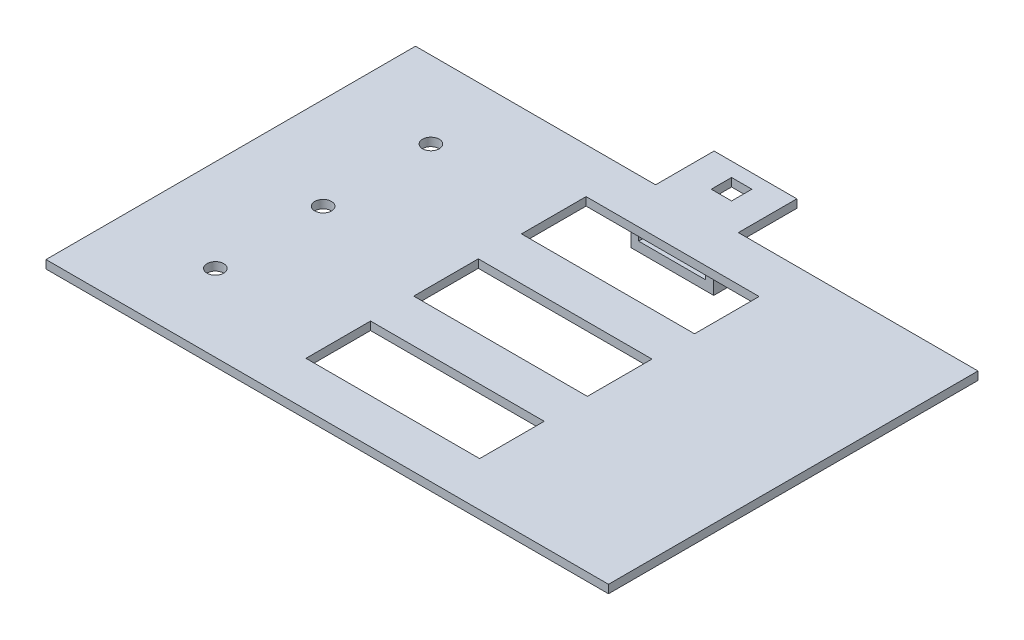
ISO-10303-21;
HEADER;
FILE_DESCRIPTION(('STEP AP214'),'2;1');
FILE_NAME('part.step','',(''),(''),'','','');
FILE_SCHEMA(('AUTOMOTIVE_DESIGN { 1 0 10303 214 1 1 1 1 }'));
ENDSEC;
DATA;
#1=APPLICATION_CONTEXT('core data for automotive mechanical design processes');
#2=APPLICATION_PROTOCOL_DEFINITION('international standard','automotive_design',2000,#1);
#3=PRODUCT_CONTEXT('',#1,'mechanical');
#4=PRODUCT('Part','Part','',(#3));
#5=PRODUCT_RELATED_PRODUCT_CATEGORY('part','',(#4));
#6=PRODUCT_DEFINITION_FORMATION('','',#4);
#7=PRODUCT_DEFINITION_CONTEXT('part definition',#1,'design');
#8=PRODUCT_DEFINITION('design','',#6,#7);
#9=PRODUCT_DEFINITION_SHAPE('','',#8);
#10=(LENGTH_UNIT() NAMED_UNIT(*) SI_UNIT(.MILLI.,.METRE.));
#11=(NAMED_UNIT(*) PLANE_ANGLE_UNIT() SI_UNIT($,.RADIAN.));
#12=(NAMED_UNIT(*) SI_UNIT($,.STERADIAN.) SOLID_ANGLE_UNIT());
#13=UNCERTAINTY_MEASURE_WITH_UNIT(LENGTH_MEASURE(1.E-05),#10,'distance_accuracy_value','');
#14=(GEOMETRIC_REPRESENTATION_CONTEXT(3) GLOBAL_UNCERTAINTY_ASSIGNED_CONTEXT((#13)) GLOBAL_UNIT_ASSIGNED_CONTEXT((#10,
#11,#12)) REPRESENTATION_CONTEXT('',''));
#15=CARTESIAN_POINT('',(0.,0.,0.));
#16=DIRECTION('',(0.,0.,1.));
#17=DIRECTION('',(1.,0.,0.));
#18=AXIS2_PLACEMENT_3D('',#15,#16,#17);
#19=CARTESIAN_POINT('',(0.,3.4036,-152.4));
#20=DIRECTION('',(0.,0.,1.));
#21=DIRECTION('',(1.,0.,0.));
#22=AXIS2_PLACEMENT_3D('',#19,#20,#21);
#23=PLANE('',#22);
#24=DIRECTION('',(0.,-1.,0.));
#25=VECTOR('',#24,1.);
#26=CARTESIAN_POINT('',(133.1595,0.,-152.4));
#27=LINE('',#26,#25);
#28=CARTESIAN_POINT('',(133.1595,3.4036,-152.4));
#29=VERTEX_POINT('',#28);
#30=CARTESIAN_POINT('',(133.1595,0.,-152.4));
#31=VERTEX_POINT('',#30);
#32=EDGE_CURVE('E287',#29,#31,#27,.T.);
#33=ORIENTED_EDGE('',*,*,#32,.F.);
#34=DIRECTION('',(-1.,0.,0.));
#35=VECTOR('',#34,1.);
#36=CARTESIAN_POINT('',(0.,3.4036,-152.4));
#37=LINE('',#36,#35);
#38=CARTESIAN_POINT('',(232.0036,3.4036,-152.4));
#39=VERTEX_POINT('',#38);
#40=EDGE_CURVE('E584',#39,#29,#37,.T.);
#41=ORIENTED_EDGE('',*,*,#40,.F.);
#42=DIRECTION('',(0.,-1.,0.));
#43=VECTOR('',#42,1.);
#44=CARTESIAN_POINT('',(232.0036,3.4036,-152.4));
#45=LINE('',#44,#43);
#46=CARTESIAN_POINT('',(232.0036,0.,-152.4));
#47=VERTEX_POINT('',#46);
#48=EDGE_CURVE('E605',#39,#47,#45,.T.);
#49=ORIENTED_EDGE('',*,*,#48,.T.);
#50=DIRECTION('',(-1.,0.,0.));
#51=VECTOR('',#50,1.);
#52=CARTESIAN_POINT('',(0.,0.,-152.4));
#53=LINE('',#52,#51);
#54=EDGE_CURVE('E577',#47,#31,#53,.T.);
#55=ORIENTED_EDGE('',*,*,#54,.T.);
#56=EDGE_LOOP('',(#33,#41,#49,#55));
#57=FACE_BOUND('',#56,.T.);
#58=ADVANCED_FACE('F46',(#57),#23,.F.);
#59=DIRECTION('',(0.,1.,0.));
#60=VECTOR('',#59,1.);
#61=CARTESIAN_POINT('',(99.0219,0.,-152.4));
#62=LINE('',#61,#60);
#63=CARTESIAN_POINT('',(99.0219,0.,-152.4));
#64=VERTEX_POINT('',#63);
#65=CARTESIAN_POINT('',(99.0219,3.4036,-152.4));
#66=VERTEX_POINT('',#65);
#67=EDGE_CURVE('E297',#64,#66,#62,.T.);
#68=ORIENTED_EDGE('',*,*,#67,.F.);
#69=CARTESIAN_POINT('',(0.,0.,-152.4));
#70=VERTEX_POINT('',#69);
#71=EDGE_CURVE('E598',#64,#70,#53,.T.);
#72=ORIENTED_EDGE('',*,*,#71,.T.);
#73=DIRECTION('',(0.,-1.,0.));
#74=VECTOR('',#73,1.);
#75=CARTESIAN_POINT('',(0.,3.4036,-152.4));
#76=LINE('',#75,#74);
#77=CARTESIAN_POINT('',(0.,3.4036,-152.4));
#78=VERTEX_POINT('',#77);
#79=EDGE_CURVE('E588',#78,#70,#76,.T.);
#80=ORIENTED_EDGE('',*,*,#79,.F.);
#81=EDGE_CURVE('E583',#66,#78,#37,.T.);
#82=ORIENTED_EDGE('',*,*,#81,.F.);
#83=EDGE_LOOP('',(#68,#72,#80,#82));
#84=FACE_BOUND('',#83,.T.);
#85=ADVANCED_FACE('F641',(#84),#23,.F.);
#86=CARTESIAN_POINT('',(0.,3.4036,0.));
#87=DIRECTION('',(1.,0.,0.));
#88=DIRECTION('',(0.,0.,-1.));
#89=AXIS2_PLACEMENT_3D('',#86,#87,#88);
#90=PLANE('',#89);
#91=DIRECTION('',(0.,0.,1.));
#92=VECTOR('',#91,1.);
#93=CARTESIAN_POINT('',(0.,0.,0.));
#94=LINE('',#93,#92);
#95=CARTESIAN_POINT('',(0.,0.,0.));
#96=VERTEX_POINT('',#95);
#97=EDGE_CURVE('E562',#70,#96,#94,.T.);
#98=ORIENTED_EDGE('',*,*,#97,.T.);
#99=DIRECTION('',(0.,-1.,0.));
#100=VECTOR('',#99,1.);
#101=CARTESIAN_POINT('',(0.,3.4036,0.));
#102=LINE('',#101,#100);
#103=CARTESIAN_POINT('',(0.,3.4036,0.));
#104=VERTEX_POINT('',#103);
#105=EDGE_CURVE('E389',#104,#96,#102,.T.);
#106=ORIENTED_EDGE('',*,*,#105,.F.);
#107=DIRECTION('',(0.,0.,1.));
#108=VECTOR('',#107,1.);
#109=CARTESIAN_POINT('',(0.,3.4036,0.));
#110=LINE('',#109,#108);
#111=EDGE_CURVE('E572',#78,#104,#110,.T.);
#112=ORIENTED_EDGE('',*,*,#111,.F.);
#113=ORIENTED_EDGE('',*,*,#79,.T.);
#114=EDGE_LOOP('',(#98,#106,#112,#113));
#115=FACE_BOUND('',#114,.T.);
#116=ADVANCED_FACE('F48',(#115),#90,.F.);
#117=CARTESIAN_POINT('',(0.,3.4036,0.));
#118=DIRECTION('',(0.,0.,-1.));
#119=DIRECTION('',(-1.,0.,0.));
#120=AXIS2_PLACEMENT_3D('',#117,#118,#119);
#121=PLANE('',#120);
#122=DIRECTION('',(1.,0.,0.));
#123=VECTOR('',#122,1.);
#124=CARTESIAN_POINT('',(0.,0.,0.));
#125=LINE('',#124,#123);
#126=CARTESIAN_POINT('',(232.0036,0.,0.));
#127=VERTEX_POINT('',#126);
#128=EDGE_CURVE('E592',#96,#127,#125,.T.);
#129=ORIENTED_EDGE('',*,*,#128,.T.);
#130=DIRECTION('',(0.,-1.,0.));
#131=VECTOR('',#130,1.);
#132=CARTESIAN_POINT('',(232.0036,3.4036,0.));
#133=LINE('',#132,#131);
#134=CARTESIAN_POINT('',(232.0036,3.4036,0.));
#135=VERTEX_POINT('',#134);
#136=EDGE_CURVE('E609',#135,#127,#133,.T.);
#137=ORIENTED_EDGE('',*,*,#136,.F.);
#138=DIRECTION('',(1.,0.,0.));
#139=VECTOR('',#138,1.);
#140=CARTESIAN_POINT('',(0.,3.4036,0.));
#141=LINE('',#140,#139);
#142=EDGE_CURVE('E576',#104,#135,#141,.T.);
#143=ORIENTED_EDGE('',*,*,#142,.F.);
#144=ORIENTED_EDGE('',*,*,#105,.T.);
#145=EDGE_LOOP('',(#129,#137,#143,#144));
#146=FACE_BOUND('',#145,.T.);
#147=ADVANCED_FACE('F656',(#146),#121,.F.);
#148=CARTESIAN_POINT('',(232.0036,3.4036,0.));
#149=DIRECTION('',(-1.,0.,0.));
#150=DIRECTION('',(0.,0.,1.));
#151=AXIS2_PLACEMENT_3D('',#148,#149,#150);
#152=PLANE('',#151);
#153=DIRECTION('',(0.,0.,-1.));
#154=VECTOR('',#153,1.);
#155=CARTESIAN_POINT('',(232.0036,0.,0.));
#156=LINE('',#155,#154);
#157=EDGE_CURVE('E595',#127,#47,#156,.T.);
#158=ORIENTED_EDGE('',*,*,#157,.T.);
#159=ORIENTED_EDGE('',*,*,#48,.F.);
#160=DIRECTION('',(0.,0.,-1.));
#161=VECTOR('',#160,1.);
#162=CARTESIAN_POINT('',(232.0036,3.4036,0.));
#163=LINE('',#162,#161);
#164=EDGE_CURVE('E580',#135,#39,#163,.T.);
#165=ORIENTED_EDGE('',*,*,#164,.F.);
#166=ORIENTED_EDGE('',*,*,#136,.T.);
#167=EDGE_LOOP('',(#158,#159,#165,#166));
#168=FACE_BOUND('',#167,.T.);
#169=ADVANCED_FACE('F654',(#168),#152,.F.);
#170=CARTESIAN_POINT('',(0.,3.4036,0.));
#171=DIRECTION('',(0.,-1.,0.));
#172=DIRECTION('',(0.,0.,-1.));
#173=AXIS2_PLACEMENT_3D('',#170,#171,#172);
#174=PLANE('',#173);
#175=DIRECTION('',(1.,0.,0.));
#176=VECTOR('',#175,1.);
#177=CARTESIAN_POINT('',(112.0775,3.4036,-162.306));
#178=LINE('',#177,#176);
#179=CARTESIAN_POINT('',(112.0775,3.4036,-162.306));
#180=VERTEX_POINT('',#179);
#181=CARTESIAN_POINT('',(120.4595,3.4036,-162.306));
#182=VERTEX_POINT('',#181);
#183=EDGE_CURVE('E269',#180,#182,#178,.T.);
#184=ORIENTED_EDGE('',*,*,#183,.F.);
#185=DIRECTION('',(0.,0.,1.));
#186=VECTOR('',#185,1.);
#187=CARTESIAN_POINT('',(112.0775,3.4036,-170.688));
#188=LINE('',#187,#186);
#189=CARTESIAN_POINT('',(112.0775,3.4036,-170.688));
#190=VERTEX_POINT('',#189);
#191=EDGE_CURVE('E62',#190,#180,#188,.T.);
#192=ORIENTED_EDGE('',*,*,#191,.F.);
#193=DIRECTION('',(-1.,0.,0.));
#194=VECTOR('',#193,1.);
#195=CARTESIAN_POINT('',(112.0775,3.4036,-170.688));
#196=LINE('',#195,#194);
#197=CARTESIAN_POINT('',(120.4595,3.4036,-170.688));
#198=VERTEX_POINT('',#197);
#199=EDGE_CURVE('E277',#198,#190,#196,.T.);
#200=ORIENTED_EDGE('',*,*,#199,.F.);
#201=DIRECTION('',(0.,0.,-1.));
#202=VECTOR('',#201,1.);
#203=CARTESIAN_POINT('',(120.4595,3.4036,-170.688));
#204=LINE('',#203,#202);
#205=EDGE_CURVE('E259',#182,#198,#204,.T.);
#206=ORIENTED_EDGE('',*,*,#205,.F.);
#207=EDGE_LOOP('',(#184,#192,#200,#206));
#208=FACE_BOUND('',#207,.T.);
#209=DIRECTION('',(1.,0.,0.));
#210=VECTOR('',#209,1.);
#211=CARTESIAN_POINT('',(88.9,3.4036,-62.7634));
#212=LINE('',#211,#210);
#213=CARTESIAN_POINT('',(88.9,3.4036,-62.7634));
#214=VERTEX_POINT('',#213);
#215=CARTESIAN_POINT('',(160.528,3.4036,-62.7634));
#216=VERTEX_POINT('',#215);
#217=EDGE_CURVE('E448',#214,#216,#212,.T.);
#218=ORIENTED_EDGE('',*,*,#217,.F.);
#219=DIRECTION('',(0.,0.,1.));
#220=VECTOR('',#219,1.);
#221=CARTESIAN_POINT('',(88.9,3.4036,-89.408));
#222=LINE('',#221,#220);
#223=CARTESIAN_POINT('',(88.9,3.4036,-89.408));
#224=VERTEX_POINT('',#223);
#225=EDGE_CURVE('E452',#224,#214,#222,.T.);
#226=ORIENTED_EDGE('',*,*,#225,.F.);
#227=DIRECTION('',(-1.,0.,0.));
#228=VECTOR('',#227,1.);
#229=CARTESIAN_POINT('',(88.9,3.4036,-89.408));
#230=LINE('',#229,#228);
#231=CARTESIAN_POINT('',(160.528,3.4036,-89.408));
#232=VERTEX_POINT('',#231);
#233=EDGE_CURVE('E439',#232,#224,#230,.T.);
#234=ORIENTED_EDGE('',*,*,#233,.F.);
#235=DIRECTION('',(0.,0.,-1.));
#236=VECTOR('',#235,1.);
#237=CARTESIAN_POINT('',(160.528,3.4036,-89.408));
#238=LINE('',#237,#236);
#239=EDGE_CURVE('E443',#216,#232,#238,.T.);
#240=ORIENTED_EDGE('',*,*,#239,.F.);
#241=EDGE_LOOP('',(#218,#226,#234,#240));
#242=FACE_BOUND('',#241,.T.);
#243=DIRECTION('',(1.,0.,0.));
#244=VECTOR('',#243,1.);
#245=CARTESIAN_POINT('',(88.9,3.4036,-18.3134));
#246=LINE('',#245,#244);
#247=CARTESIAN_POINT('',(88.9,3.4036,-18.3134));
#248=VERTEX_POINT('',#247);
#249=CARTESIAN_POINT('',(160.528,3.4036,-18.3134));
#250=VERTEX_POINT('',#249);
#251=EDGE_CURVE('E494',#248,#250,#246,.T.);
#252=ORIENTED_EDGE('',*,*,#251,.F.);
#253=DIRECTION('',(0.,0.,1.));
#254=VECTOR('',#253,1.);
#255=CARTESIAN_POINT('',(88.9,3.4036,-44.958));
#256=LINE('',#255,#254);
#257=CARTESIAN_POINT('',(88.9,3.4036,-44.958));
#258=VERTEX_POINT('',#257);
#259=EDGE_CURVE('E438',#258,#248,#256,.T.);
#260=ORIENTED_EDGE('',*,*,#259,.F.);
#261=DIRECTION('',(-1.,0.,0.));
#262=VECTOR('',#261,1.);
#263=CARTESIAN_POINT('',(88.9,3.4036,-44.958));
#264=LINE('',#263,#262);
#265=CARTESIAN_POINT('',(160.528,3.4036,-44.958));
#266=VERTEX_POINT('',#265);
#267=EDGE_CURVE('E485',#266,#258,#264,.T.);
#268=ORIENTED_EDGE('',*,*,#267,.F.);
#269=DIRECTION('',(0.,0.,-1.));
#270=VECTOR('',#269,1.);
#271=CARTESIAN_POINT('',(160.528,3.4036,-44.958));
#272=LINE('',#271,#270);
#273=EDGE_CURVE('E489',#250,#266,#272,.T.);
#274=ORIENTED_EDGE('',*,*,#273,.F.);
#275=EDGE_LOOP('',(#252,#260,#268,#274));
#276=FACE_BOUND('',#275,.T.);
#277=CARTESIAN_POINT('',(38.1,3.4036,-120.65));
#278=DIRECTION('',(0.,1.,0.));
#279=DIRECTION('',(0.,0.,1.));
#280=AXIS2_PLACEMENT_3D('',#277,#278,#279);
#281=CIRCLE('',#280,3.4417);
#282=CARTESIAN_POINT('',(38.1,3.4036,-117.2083));
#283=VERTEX_POINT('',#282);
#284=EDGE_CURVE('E484',#283,#283,#281,.T.);
#285=ORIENTED_EDGE('',*,*,#284,.F.);
#286=EDGE_LOOP('',(#285));
#287=FACE_BOUND('',#286,.T.);
#288=CARTESIAN_POINT('',(38.1,3.4036,-76.2));
#289=DIRECTION('',(0.,1.,0.));
#290=DIRECTION('',(0.,0.,1.));
#291=AXIS2_PLACEMENT_3D('',#288,#289,#290);
#292=CIRCLE('',#291,3.4417);
#293=CARTESIAN_POINT('',(38.1,3.4036,-72.7583));
#294=VERTEX_POINT('',#293);
#295=EDGE_CURVE('E521',#294,#294,#292,.T.);
#296=ORIENTED_EDGE('',*,*,#295,.F.);
#297=EDGE_LOOP('',(#296));
#298=FACE_BOUND('',#297,.T.);
#299=CARTESIAN_POINT('',(38.1,3.4036,-31.75));
#300=DIRECTION('',(0.,1.,0.));
#301=DIRECTION('',(0.,0.,1.));
#302=AXIS2_PLACEMENT_3D('',#299,#300,#301);
#303=CIRCLE('',#302,3.4417);
#304=CARTESIAN_POINT('',(38.1,3.4036,-28.3083));
#305=VERTEX_POINT('',#304);
#306=EDGE_CURVE('E416',#305,#305,#303,.T.);
#307=ORIENTED_EDGE('',*,*,#306,.F.);
#308=EDGE_LOOP('',(#307));
#309=FACE_BOUND('',#308,.T.);
#310=DIRECTION('',(1.,0.,0.));
#311=VECTOR('',#310,1.);
#312=CARTESIAN_POINT('',(88.9,3.4036,-107.2134));
#313=LINE('',#312,#311);
#314=CARTESIAN_POINT('',(88.9,3.4036,-107.2134));
#315=VERTEX_POINT('',#314);
#316=CARTESIAN_POINT('',(160.274,3.4036,-107.2134));
#317=VERTEX_POINT('',#316);
#318=EDGE_CURVE('E548',#315,#317,#313,.T.);
#319=ORIENTED_EDGE('',*,*,#318,.F.);
#320=DIRECTION('',(0.,0.,1.));
#321=VECTOR('',#320,1.);
#322=CARTESIAN_POINT('',(88.9,3.4036,-133.858));
#323=LINE('',#322,#321);
#324=CARTESIAN_POINT('',(88.9,3.4036,-133.858));
#325=VERTEX_POINT('',#324);
#326=EDGE_CURVE('E455',#325,#315,#323,.T.);
#327=ORIENTED_EDGE('',*,*,#326,.F.);
#328=DIRECTION('',(-1.,0.,0.));
#329=VECTOR('',#328,1.);
#330=CARTESIAN_POINT('',(88.9,3.4036,-133.858));
#331=LINE('',#330,#329);
#332=CARTESIAN_POINT('',(160.274,3.4036,-133.858));
#333=VERTEX_POINT('',#332);
#334=EDGE_CURVE('E533',#333,#325,#331,.T.);
#335=ORIENTED_EDGE('',*,*,#334,.F.);
#336=DIRECTION('',(0.,0.,-1.));
#337=VECTOR('',#336,1.);
#338=CARTESIAN_POINT('',(160.274,3.4036,-133.858));
#339=LINE('',#338,#337);
#340=EDGE_CURVE('E552',#317,#333,#339,.T.);
#341=ORIENTED_EDGE('',*,*,#340,.F.);
#342=EDGE_LOOP('',(#319,#327,#335,#341));
#343=FACE_BOUND('',#342,.T.);
#344=ORIENTED_EDGE('',*,*,#111,.T.);
#345=ORIENTED_EDGE('',*,*,#142,.T.);
#346=ORIENTED_EDGE('',*,*,#164,.T.);
#347=ORIENTED_EDGE('',*,*,#40,.T.);
#348=DIRECTION('',(0.,0.,1.));
#349=VECTOR('',#348,1.);
#350=CARTESIAN_POINT('',(133.1595,3.4036,-176.53));
#351=LINE('',#350,#349);
#352=CARTESIAN_POINT('',(133.1595,3.4036,-176.53));
#353=VERTEX_POINT('',#352);
#354=EDGE_CURVE('E306',#353,#29,#351,.T.);
#355=ORIENTED_EDGE('',*,*,#354,.F.);
#356=DIRECTION('',(1.,0.,0.));
#357=VECTOR('',#356,1.);
#358=CARTESIAN_POINT('',(133.1595,3.4036,-176.53));
#359=LINE('',#358,#357);
#360=CARTESIAN_POINT('',(99.0219,3.4036,-176.53));
#361=VERTEX_POINT('',#360);
#362=EDGE_CURVE('E303',#361,#353,#359,.T.);
#363=ORIENTED_EDGE('',*,*,#362,.F.);
#364=DIRECTION('',(0.,0.,1.));
#365=VECTOR('',#364,1.);
#366=CARTESIAN_POINT('',(99.0219,3.4036,-176.53));
#367=LINE('',#366,#365);
#368=EDGE_CURVE('E313',#361,#66,#367,.T.);
#369=ORIENTED_EDGE('',*,*,#368,.T.);
#370=ORIENTED_EDGE('',*,*,#81,.T.);
#371=EDGE_LOOP('',(#344,#345,#346,#347,#355,#363,#369,#370));
#372=FACE_BOUND('',#371,.T.);
#373=ADVANCED_FACE('F274',(#208,#242,#276,#287,#298,#309,#343,#372),#174,.F.);
#374=CARTESIAN_POINT('',(0.,0.,0.));
#375=DIRECTION('',(0.,-1.,0.));
#376=DIRECTION('',(0.,0.,-1.));
#377=AXIS2_PLACEMENT_3D('',#374,#375,#376);
#378=PLANE('',#377);
#379=DIRECTION('',(0.,0.,1.));
#380=VECTOR('',#379,1.);
#381=CARTESIAN_POINT('',(133.1595,0.,-142.24));
#382=LINE('',#381,#380);
#383=CARTESIAN_POINT('',(133.1595,0.,-142.24));
#384=VERTEX_POINT('',#383);
#385=EDGE_CURVE('E384',#31,#384,#382,.T.);
#386=ORIENTED_EDGE('',*,*,#385,.F.);
#387=ORIENTED_EDGE('',*,*,#54,.F.);
#388=ORIENTED_EDGE('',*,*,#157,.F.);
#389=ORIENTED_EDGE('',*,*,#128,.F.);
#390=ORIENTED_EDGE('',*,*,#97,.F.);
#391=ORIENTED_EDGE('',*,*,#71,.F.);
#392=DIRECTION('',(0.,0.,-1.));
#393=VECTOR('',#392,1.);
#394=CARTESIAN_POINT('',(99.0219,0.,-142.24));
#395=LINE('',#394,#393);
#396=CARTESIAN_POINT('',(99.0219,0.,-142.24));
#397=VERTEX_POINT('',#396);
#398=EDGE_CURVE('E393',#397,#64,#395,.T.);
#399=ORIENTED_EDGE('',*,*,#398,.F.);
#400=DIRECTION('',(-1.,0.,0.));
#401=VECTOR('',#400,1.);
#402=CARTESIAN_POINT('',(133.1595,0.,-142.24));
#403=LINE('',#402,#401);
#404=EDGE_CURVE('E368',#384,#397,#403,.T.);
#405=ORIENTED_EDGE('',*,*,#404,.F.);
#406=EDGE_LOOP('',(#386,#387,#388,#389,#390,#391,#399,#405));
#407=FACE_BOUND('',#406,.T.);
#408=DIRECTION('',(0.,0.,1.));
#409=VECTOR('',#408,1.);
#410=CARTESIAN_POINT('',(88.9,0.,-89.408));
#411=LINE('',#410,#409);
#412=CARTESIAN_POINT('',(88.9,0.,-89.408));
#413=VERTEX_POINT('',#412);
#414=CARTESIAN_POINT('',(88.9,0.,-62.7634));
#415=VERTEX_POINT('',#414);
#416=EDGE_CURVE('E444',#413,#415,#411,.T.);
#417=ORIENTED_EDGE('',*,*,#416,.T.);
#418=DIRECTION('',(1.,0.,0.));
#419=VECTOR('',#418,1.);
#420=CARTESIAN_POINT('',(88.9,0.,-62.7634));
#421=LINE('',#420,#419);
#422=CARTESIAN_POINT('',(160.528,0.,-62.7634));
#423=VERTEX_POINT('',#422);
#424=EDGE_CURVE('E463',#415,#423,#421,.T.);
#425=ORIENTED_EDGE('',*,*,#424,.T.);
#426=DIRECTION('',(0.,0.,-1.));
#427=VECTOR('',#426,1.);
#428=CARTESIAN_POINT('',(160.528,0.,-89.408));
#429=LINE('',#428,#427);
#430=CARTESIAN_POINT('',(160.528,0.,-89.408));
#431=VERTEX_POINT('',#430);
#432=EDGE_CURVE('E459',#423,#431,#429,.T.);
#433=ORIENTED_EDGE('',*,*,#432,.T.);
#434=DIRECTION('',(-1.,0.,0.));
#435=VECTOR('',#434,1.);
#436=CARTESIAN_POINT('',(88.9,0.,-89.408));
#437=LINE('',#436,#435);
#438=EDGE_CURVE('E428',#431,#413,#437,.T.);
#439=ORIENTED_EDGE('',*,*,#438,.T.);
#440=EDGE_LOOP('',(#417,#425,#433,#439));
#441=FACE_BOUND('',#440,.T.);
#442=DIRECTION('',(0.,0.,1.));
#443=VECTOR('',#442,1.);
#444=CARTESIAN_POINT('',(88.9,0.,-44.958));
#445=LINE('',#444,#443);
#446=CARTESIAN_POINT('',(88.9,0.,-44.958));
#447=VERTEX_POINT('',#446);
#448=CARTESIAN_POINT('',(88.9,0.,-18.3134));
#449=VERTEX_POINT('',#448);
#450=EDGE_CURVE('E490',#447,#449,#445,.T.);
#451=ORIENTED_EDGE('',*,*,#450,.T.);
#452=DIRECTION('',(1.,0.,0.));
#453=VECTOR('',#452,1.);
#454=CARTESIAN_POINT('',(88.9,0.,-18.3134));
#455=LINE('',#454,#453);
#456=CARTESIAN_POINT('',(160.528,0.,-18.3134));
#457=VERTEX_POINT('',#456);
#458=EDGE_CURVE('E507',#449,#457,#455,.T.);
#459=ORIENTED_EDGE('',*,*,#458,.T.);
#460=DIRECTION('',(0.,0.,-1.));
#461=VECTOR('',#460,1.);
#462=CARTESIAN_POINT('',(160.528,0.,-44.958));
#463=LINE('',#462,#461);
#464=CARTESIAN_POINT('',(160.528,0.,-44.958));
#465=VERTEX_POINT('',#464);
#466=EDGE_CURVE('E503',#457,#465,#463,.T.);
#467=ORIENTED_EDGE('',*,*,#466,.T.);
#468=DIRECTION('',(-1.,0.,0.));
#469=VECTOR('',#468,1.);
#470=CARTESIAN_POINT('',(88.9,0.,-44.958));
#471=LINE('',#470,#469);
#472=EDGE_CURVE('E474',#465,#447,#471,.T.);
#473=ORIENTED_EDGE('',*,*,#472,.T.);
#474=EDGE_LOOP('',(#451,#459,#467,#473));
#475=FACE_BOUND('',#474,.T.);
#476=CARTESIAN_POINT('',(38.1,0.,-120.65));
#477=DIRECTION('',(0.,1.,0.));
#478=DIRECTION('',(0.,0.,1.));
#479=AXIS2_PLACEMENT_3D('',#476,#477,#478);
#480=CIRCLE('',#479,3.4417);
#481=CARTESIAN_POINT('',(38.1,0.,-117.2083));
#482=VERTEX_POINT('',#481);
#483=EDGE_CURVE('E517',#482,#482,#480,.T.);
#484=ORIENTED_EDGE('',*,*,#483,.T.);
#485=EDGE_LOOP('',(#484));
#486=FACE_BOUND('',#485,.T.);
#487=CARTESIAN_POINT('',(38.1,0.,-76.2));
#488=DIRECTION('',(0.,1.,0.));
#489=DIRECTION('',(0.,0.,1.));
#490=AXIS2_PLACEMENT_3D('',#487,#488,#489);
#491=CIRCLE('',#490,3.4417);
#492=CARTESIAN_POINT('',(38.1,0.,-72.7583));
#493=VERTEX_POINT('',#492);
#494=EDGE_CURVE('E420',#493,#493,#491,.T.);
#495=ORIENTED_EDGE('',*,*,#494,.T.);
#496=EDGE_LOOP('',(#495));
#497=FACE_BOUND('',#496,.T.);
#498=CARTESIAN_POINT('',(38.1,0.,-31.75));
#499=DIRECTION('',(0.,1.,0.));
#500=DIRECTION('',(0.,0.,1.));
#501=AXIS2_PLACEMENT_3D('',#498,#499,#500);
#502=CIRCLE('',#501,3.4417);
#503=CARTESIAN_POINT('',(38.1,0.,-28.3083));
#504=VERTEX_POINT('',#503);
#505=EDGE_CURVE('E415',#504,#504,#502,.T.);
#506=ORIENTED_EDGE('',*,*,#505,.T.);
#507=EDGE_LOOP('',(#506));
#508=FACE_BOUND('',#507,.T.);
#509=DIRECTION('',(0.,0.,1.));
#510=VECTOR('',#509,1.);
#511=CARTESIAN_POINT('',(88.9,0.,-133.858));
#512=LINE('',#511,#510);
#513=CARTESIAN_POINT('',(88.9,0.,-133.858));
#514=VERTEX_POINT('',#513);
#515=CARTESIAN_POINT('',(88.9,0.,-107.2134));
#516=VERTEX_POINT('',#515);
#517=EDGE_CURVE('E528',#514,#516,#512,.T.);
#518=ORIENTED_EDGE('',*,*,#517,.T.);
#519=DIRECTION('',(1.,0.,0.));
#520=VECTOR('',#519,1.);
#521=CARTESIAN_POINT('',(88.9,0.,-107.2134));
#522=LINE('',#521,#520);
#523=CARTESIAN_POINT('',(160.274,0.,-107.2134));
#524=VERTEX_POINT('',#523);
#525=EDGE_CURVE('E532',#516,#524,#522,.T.);
#526=ORIENTED_EDGE('',*,*,#525,.T.);
#527=DIRECTION('',(0.,0.,-1.));
#528=VECTOR('',#527,1.);
#529=CARTESIAN_POINT('',(160.274,0.,-133.858));
#530=LINE('',#529,#528);
#531=CARTESIAN_POINT('',(160.274,0.,-133.858));
#532=VERTEX_POINT('',#531);
#533=EDGE_CURVE('E537',#524,#532,#530,.T.);
#534=ORIENTED_EDGE('',*,*,#533,.T.);
#535=DIRECTION('',(-1.,0.,0.));
#536=VECTOR('',#535,1.);
#537=CARTESIAN_POINT('',(88.9,0.,-133.858));
#538=LINE('',#537,#536);
#539=EDGE_CURVE('E541',#532,#514,#538,.T.);
#540=ORIENTED_EDGE('',*,*,#539,.T.);
#541=EDGE_LOOP('',(#518,#526,#534,#540));
#542=FACE_BOUND('',#541,.T.);
#543=ADVANCED_FACE('F652',(#407,#441,#475,#486,#497,#508,#542),#378,.T.);
#544=CARTESIAN_POINT('',(88.9,0.,-133.858));
#545=DIRECTION('',(-1.,0.,0.));
#546=DIRECTION('',(0.,0.,1.));
#547=AXIS2_PLACEMENT_3D('',#544,#545,#546);
#548=PLANE('',#547);
#549=ORIENTED_EDGE('',*,*,#326,.T.);
#550=DIRECTION('',(0.,1.,0.));
#551=VECTOR('',#550,1.);
#552=CARTESIAN_POINT('',(88.9,0.,-107.2134));
#553=LINE('',#552,#551);
#554=EDGE_CURVE('E545',#516,#315,#553,.T.);
#555=ORIENTED_EDGE('',*,*,#554,.F.);
#556=ORIENTED_EDGE('',*,*,#517,.F.);
#557=DIRECTION('',(0.,1.,0.));
#558=VECTOR('',#557,1.);
#559=CARTESIAN_POINT('',(88.9,0.,-133.858));
#560=LINE('',#559,#558);
#561=EDGE_CURVE('E559',#514,#325,#560,.T.);
#562=ORIENTED_EDGE('',*,*,#561,.T.);
#563=EDGE_LOOP('',(#549,#555,#556,#562));
#564=FACE_BOUND('',#563,.T.);
#565=ADVANCED_FACE('F776',(#564),#548,.F.);
#566=CARTESIAN_POINT('',(88.9,0.,-133.858));
#567=DIRECTION('',(0.,0.,-1.));
#568=DIRECTION('',(-1.,0.,0.));
#569=AXIS2_PLACEMENT_3D('',#566,#567,#568);
#570=PLANE('',#569);
#571=ORIENTED_EDGE('',*,*,#334,.T.);
#572=ORIENTED_EDGE('',*,*,#561,.F.);
#573=ORIENTED_EDGE('',*,*,#539,.F.);
#574=DIRECTION('',(0.,1.,0.));
#575=VECTOR('',#574,1.);
#576=CARTESIAN_POINT('',(160.274,0.,-133.858));
#577=LINE('',#576,#575);
#578=EDGE_CURVE('E563',#532,#333,#577,.T.);
#579=ORIENTED_EDGE('',*,*,#578,.T.);
#580=EDGE_LOOP('',(#571,#572,#573,#579));
#581=FACE_BOUND('',#580,.T.);
#582=ADVANCED_FACE('F772',(#581),#570,.F.);
#583=CARTESIAN_POINT('',(160.274,0.,-133.858));
#584=DIRECTION('',(1.,0.,0.));
#585=DIRECTION('',(0.,0.,-1.));
#586=AXIS2_PLACEMENT_3D('',#583,#584,#585);
#587=PLANE('',#586);
#588=ORIENTED_EDGE('',*,*,#340,.T.);
#589=ORIENTED_EDGE('',*,*,#578,.F.);
#590=ORIENTED_EDGE('',*,*,#533,.F.);
#591=DIRECTION('',(0.,1.,0.));
#592=VECTOR('',#591,1.);
#593=CARTESIAN_POINT('',(160.274,0.,-107.2134));
#594=LINE('',#593,#592);
#595=EDGE_CURVE('E566',#524,#317,#594,.T.);
#596=ORIENTED_EDGE('',*,*,#595,.T.);
#597=EDGE_LOOP('',(#588,#589,#590,#596));
#598=FACE_BOUND('',#597,.T.);
#599=ADVANCED_FACE('F775',(#598),#587,.F.);
#600=CARTESIAN_POINT('',(88.9,0.,-107.2134));
#601=DIRECTION('',(0.,0.,1.));
#602=DIRECTION('',(1.,0.,0.));
#603=AXIS2_PLACEMENT_3D('',#600,#601,#602);
#604=PLANE('',#603);
#605=ORIENTED_EDGE('',*,*,#318,.T.);
#606=ORIENTED_EDGE('',*,*,#595,.F.);
#607=ORIENTED_EDGE('',*,*,#525,.F.);
#608=ORIENTED_EDGE('',*,*,#554,.T.);
#609=EDGE_LOOP('',(#605,#606,#607,#608));
#610=FACE_BOUND('',#609,.T.);
#611=ADVANCED_FACE('F733',(#610),#604,.F.);
#612=CARTESIAN_POINT('',(38.1,0.,-31.75));
#613=DIRECTION('',(0.,1.,0.));
#614=DIRECTION('',(0.,0.,1.));
#615=AXIS2_PLACEMENT_3D('',#612,#613,#614);
#616=CYLINDRICAL_SURFACE('',#615,3.4417);
#617=ORIENTED_EDGE('',*,*,#505,.F.);
#618=EDGE_LOOP('',(#617));
#619=FACE_BOUND('',#618,.T.);
#620=ORIENTED_EDGE('',*,*,#306,.T.);
#621=EDGE_LOOP('',(#620));
#622=FACE_BOUND('',#621,.T.);
#623=ADVANCED_FACE('F729',(#619,#622),#616,.F.);
#624=CARTESIAN_POINT('',(38.1,0.,-76.2));
#625=DIRECTION('',(0.,1.,0.));
#626=DIRECTION('',(0.,0.,1.));
#627=AXIS2_PLACEMENT_3D('',#624,#625,#626);
#628=CYLINDRICAL_SURFACE('',#627,3.4417);
#629=ORIENTED_EDGE('',*,*,#494,.F.);
#630=EDGE_LOOP('',(#629));
#631=FACE_BOUND('',#630,.T.);
#632=ORIENTED_EDGE('',*,*,#295,.T.);
#633=EDGE_LOOP('',(#632));
#634=FACE_BOUND('',#633,.T.);
#635=ADVANCED_FACE('F732',(#631,#634),#628,.F.);
#636=CARTESIAN_POINT('',(38.1,0.,-120.65));
#637=DIRECTION('',(0.,1.,0.));
#638=DIRECTION('',(0.,0.,1.));
#639=AXIS2_PLACEMENT_3D('',#636,#637,#638);
#640=CYLINDRICAL_SURFACE('',#639,3.4417);
#641=ORIENTED_EDGE('',*,*,#483,.F.);
#642=EDGE_LOOP('',(#641));
#643=FACE_BOUND('',#642,.T.);
#644=ORIENTED_EDGE('',*,*,#284,.T.);
#645=EDGE_LOOP('',(#644));
#646=FACE_BOUND('',#645,.T.);
#647=ADVANCED_FACE('F754',(#643,#646),#640,.F.);
#648=CARTESIAN_POINT('',(88.9,0.,-44.958));
#649=DIRECTION('',(-1.,0.,0.));
#650=DIRECTION('',(0.,0.,1.));
#651=AXIS2_PLACEMENT_3D('',#648,#649,#650);
#652=PLANE('',#651);
#653=ORIENTED_EDGE('',*,*,#259,.T.);
#654=DIRECTION('',(0.,1.,0.));
#655=VECTOR('',#654,1.);
#656=CARTESIAN_POINT('',(88.9,0.,-18.3134));
#657=LINE('',#656,#655);
#658=EDGE_CURVE('E470',#449,#248,#657,.T.);
#659=ORIENTED_EDGE('',*,*,#658,.F.);
#660=ORIENTED_EDGE('',*,*,#450,.F.);
#661=DIRECTION('',(0.,1.,0.));
#662=VECTOR('',#661,1.);
#663=CARTESIAN_POINT('',(88.9,0.,-44.958));
#664=LINE('',#663,#662);
#665=EDGE_CURVE('E481',#447,#258,#664,.T.);
#666=ORIENTED_EDGE('',*,*,#665,.T.);
#667=EDGE_LOOP('',(#653,#659,#660,#666));
#668=FACE_BOUND('',#667,.T.);
#669=ADVANCED_FACE('F750',(#668),#652,.F.);
#670=CARTESIAN_POINT('',(88.9,0.,-44.958));
#671=DIRECTION('',(0.,0.,-1.));
#672=DIRECTION('',(-1.,0.,0.));
#673=AXIS2_PLACEMENT_3D('',#670,#671,#672);
#674=PLANE('',#673);
#675=ORIENTED_EDGE('',*,*,#267,.T.);
#676=ORIENTED_EDGE('',*,*,#665,.F.);
#677=ORIENTED_EDGE('',*,*,#472,.F.);
#678=DIRECTION('',(0.,1.,0.));
#679=VECTOR('',#678,1.);
#680=CARTESIAN_POINT('',(160.528,0.,-44.958));
#681=LINE('',#680,#679);
#682=EDGE_CURVE('E478',#465,#266,#681,.T.);
#683=ORIENTED_EDGE('',*,*,#682,.T.);
#684=EDGE_LOOP('',(#675,#676,#677,#683));
#685=FACE_BOUND('',#684,.T.);
#686=ADVANCED_FACE('F753',(#685),#674,.F.);
#687=CARTESIAN_POINT('',(160.528,0.,-44.958));
#688=DIRECTION('',(1.,0.,0.));
#689=DIRECTION('',(0.,0.,-1.));
#690=AXIS2_PLACEMENT_3D('',#687,#688,#689);
#691=PLANE('',#690);
#692=ORIENTED_EDGE('',*,*,#273,.T.);
#693=ORIENTED_EDGE('',*,*,#682,.F.);
#694=ORIENTED_EDGE('',*,*,#466,.F.);
#695=DIRECTION('',(0.,1.,0.));
#696=VECTOR('',#695,1.);
#697=CARTESIAN_POINT('',(160.528,0.,-18.3134));
#698=LINE('',#697,#696);
#699=EDGE_CURVE('E475',#457,#250,#698,.T.);
#700=ORIENTED_EDGE('',*,*,#699,.T.);
#701=EDGE_LOOP('',(#692,#693,#694,#700));
#702=FACE_BOUND('',#701,.T.);
#703=ADVANCED_FACE('F758',(#702),#691,.F.);
#704=CARTESIAN_POINT('',(88.9,0.,-18.3134));
#705=DIRECTION('',(0.,0.,1.));
#706=DIRECTION('',(1.,0.,0.));
#707=AXIS2_PLACEMENT_3D('',#704,#705,#706);
#708=PLANE('',#707);
#709=ORIENTED_EDGE('',*,*,#251,.T.);
#710=ORIENTED_EDGE('',*,*,#699,.F.);
#711=ORIENTED_EDGE('',*,*,#458,.F.);
#712=ORIENTED_EDGE('',*,*,#658,.T.);
#713=EDGE_LOOP('',(#709,#710,#711,#712));
#714=FACE_BOUND('',#713,.T.);
#715=ADVANCED_FACE('F739',(#714),#708,.F.);
#716=CARTESIAN_POINT('',(88.9,0.,-89.408));
#717=DIRECTION('',(-1.,0.,0.));
#718=DIRECTION('',(0.,0.,1.));
#719=AXIS2_PLACEMENT_3D('',#716,#717,#718);
#720=PLANE('',#719);
#721=ORIENTED_EDGE('',*,*,#225,.T.);
#722=DIRECTION('',(0.,1.,0.));
#723=VECTOR('',#722,1.);
#724=CARTESIAN_POINT('',(88.9,0.,-62.7634));
#725=LINE('',#724,#723);
#726=EDGE_CURVE('E424',#415,#214,#725,.T.);
#727=ORIENTED_EDGE('',*,*,#726,.F.);
#728=ORIENTED_EDGE('',*,*,#416,.F.);
#729=DIRECTION('',(0.,1.,0.));
#730=VECTOR('',#729,1.);
#731=CARTESIAN_POINT('',(88.9,0.,-89.408));
#732=LINE('',#731,#730);
#733=EDGE_CURVE('E435',#413,#224,#732,.T.);
#734=ORIENTED_EDGE('',*,*,#733,.T.);
#735=EDGE_LOOP('',(#721,#727,#728,#734));
#736=FACE_BOUND('',#735,.T.);
#737=ADVANCED_FACE('F735',(#736),#720,.F.);
#738=CARTESIAN_POINT('',(88.9,0.,-89.408));
#739=DIRECTION('',(0.,0.,-1.));
#740=DIRECTION('',(-1.,0.,0.));
#741=AXIS2_PLACEMENT_3D('',#738,#739,#740);
#742=PLANE('',#741);
#743=ORIENTED_EDGE('',*,*,#233,.T.);
#744=ORIENTED_EDGE('',*,*,#733,.F.);
#745=ORIENTED_EDGE('',*,*,#438,.F.);
#746=DIRECTION('',(0.,1.,0.));
#747=VECTOR('',#746,1.);
#748=CARTESIAN_POINT('',(160.528,0.,-89.408));
#749=LINE('',#748,#747);
#750=EDGE_CURVE('E432',#431,#232,#749,.T.);
#751=ORIENTED_EDGE('',*,*,#750,.T.);
#752=EDGE_LOOP('',(#743,#744,#745,#751));
#753=FACE_BOUND('',#752,.T.);
#754=ADVANCED_FACE('F738',(#753),#742,.F.);
#755=CARTESIAN_POINT('',(160.528,0.,-89.408));
#756=DIRECTION('',(1.,0.,0.));
#757=DIRECTION('',(0.,0.,-1.));
#758=AXIS2_PLACEMENT_3D('',#755,#756,#757);
#759=PLANE('',#758);
#760=ORIENTED_EDGE('',*,*,#239,.T.);
#761=ORIENTED_EDGE('',*,*,#750,.F.);
#762=ORIENTED_EDGE('',*,*,#432,.F.);
#763=DIRECTION('',(0.,1.,0.));
#764=VECTOR('',#763,1.);
#765=CARTESIAN_POINT('',(160.528,0.,-62.7634));
#766=LINE('',#765,#764);
#767=EDGE_CURVE('E429',#423,#216,#766,.T.);
#768=ORIENTED_EDGE('',*,*,#767,.T.);
#769=EDGE_LOOP('',(#760,#761,#762,#768));
#770=FACE_BOUND('',#769,.T.);
#771=ADVANCED_FACE('F742',(#770),#759,.F.);
#772=CARTESIAN_POINT('',(88.9,0.,-62.7634));
#773=DIRECTION('',(0.,0.,1.));
#774=DIRECTION('',(1.,0.,0.));
#775=AXIS2_PLACEMENT_3D('',#772,#773,#774);
#776=PLANE('',#775);
#777=ORIENTED_EDGE('',*,*,#217,.T.);
#778=ORIENTED_EDGE('',*,*,#767,.F.);
#779=ORIENTED_EDGE('',*,*,#424,.F.);
#780=ORIENTED_EDGE('',*,*,#726,.T.);
#781=EDGE_LOOP('',(#777,#778,#779,#780));
#782=FACE_BOUND('',#781,.T.);
#783=ADVANCED_FACE('F728',(#782),#776,.F.);
#784=CARTESIAN_POINT('',(133.1595,-13.97,-142.24));
#785=DIRECTION('',(-1.,0.,0.));
#786=DIRECTION('',(0.,0.,1.));
#787=AXIS2_PLACEMENT_3D('',#784,#785,#786);
#788=PLANE('',#787);
#789=DIRECTION('',(0.,1.,0.));
#790=VECTOR('',#789,1.);
#791=CARTESIAN_POINT('',(133.1595,-13.97,-156.21));
#792=LINE('',#791,#790);
#793=CARTESIAN_POINT('',(133.1595,-13.97,-156.21));
#794=VERTEX_POINT('',#793);
#795=CARTESIAN_POINT('',(133.1595,0.,-156.21));
#796=VERTEX_POINT('',#795);
#797=EDGE_CURVE('E383',#794,#796,#792,.T.);
#798=ORIENTED_EDGE('',*,*,#797,.T.);
#799=DIRECTION('',(0.,0.,1.));
#800=VECTOR('',#799,1.);
#801=CARTESIAN_POINT('',(133.1595,0.,-176.53));
#802=LINE('',#801,#800);
#803=CARTESIAN_POINT('',(133.1595,0.,-176.53));
#804=VERTEX_POINT('',#803);
#805=EDGE_CURVE('E321',#804,#796,#802,.T.);
#806=ORIENTED_EDGE('',*,*,#805,.F.);
#807=DIRECTION('',(0.,-1.,0.));
#808=VECTOR('',#807,1.);
#809=CARTESIAN_POINT('',(133.1595,0.,-176.53));
#810=LINE('',#809,#808);
#811=EDGE_CURVE('E292',#353,#804,#810,.T.);
#812=ORIENTED_EDGE('',*,*,#811,.F.);
#813=ORIENTED_EDGE('',*,*,#354,.T.);
#814=ORIENTED_EDGE('',*,*,#32,.T.);
#815=ORIENTED_EDGE('',*,*,#385,.T.);
#816=DIRECTION('',(0.,1.,0.));
#817=VECTOR('',#816,1.);
#818=CARTESIAN_POINT('',(133.1595,-13.97,-142.24));
#819=LINE('',#818,#817);
#820=CARTESIAN_POINT('',(133.1595,-13.97,-142.24));
#821=VERTEX_POINT('',#820);
#822=EDGE_CURVE('E411',#821,#384,#819,.T.);
#823=ORIENTED_EDGE('',*,*,#822,.F.);
#824=DIRECTION('',(0.,0.,1.));
#825=VECTOR('',#824,1.);
#826=CARTESIAN_POINT('',(133.1595,-13.97,-142.24));
#827=LINE('',#826,#825);
#828=EDGE_CURVE('E369',#794,#821,#827,.T.);
#829=ORIENTED_EDGE('',*,*,#828,.F.);
#830=EDGE_LOOP('',(#798,#806,#812,#813,#814,#815,#823,#829));
#831=FACE_BOUND('',#830,.T.);
#832=ADVANCED_FACE('F694',(#831),#788,.F.);
#833=CARTESIAN_POINT('',(133.1595,-13.97,-142.24));
#834=DIRECTION('',(0.,0.,-1.));
#835=DIRECTION('',(-1.,0.,0.));
#836=AXIS2_PLACEMENT_3D('',#833,#834,#835);
#837=PLANE('',#836);
#838=DIRECTION('',(1.,0.,0.));
#839=VECTOR('',#838,1.);
#840=CARTESIAN_POINT('',(133.1595,-3.4036,-142.24));
#841=LINE('',#840,#839);
#842=CARTESIAN_POINT('',(102.1715,-3.4036,-142.24));
#843=VERTEX_POINT('',#842);
#844=CARTESIAN_POINT('',(129.7559,-3.4036,-142.24));
#845=VERTEX_POINT('',#844);
#846=EDGE_CURVE('E360',#843,#845,#841,.T.);
#847=ORIENTED_EDGE('',*,*,#846,.T.);
#848=DIRECTION('',(0.,-1.,0.));
#849=VECTOR('',#848,1.);
#850=CARTESIAN_POINT('',(129.7559,-13.97,-142.24));
#851=LINE('',#850,#849);
#852=CARTESIAN_POINT('',(129.7559,-10.0584,-142.24));
#853=VERTEX_POINT('',#852);
#854=EDGE_CURVE('E364',#845,#853,#851,.T.);
#855=ORIENTED_EDGE('',*,*,#854,.T.);
#856=DIRECTION('',(-1.,0.,0.));
#857=VECTOR('',#856,1.);
#858=CARTESIAN_POINT('',(133.1595,-10.0584,-142.24));
#859=LINE('',#858,#857);
#860=CARTESIAN_POINT('',(102.1715,-10.0584,-142.24));
#861=VERTEX_POINT('',#860);
#862=EDGE_CURVE('E343',#853,#861,#859,.T.);
#863=ORIENTED_EDGE('',*,*,#862,.T.);
#864=DIRECTION('',(0.,1.,0.));
#865=VECTOR('',#864,1.);
#866=CARTESIAN_POINT('',(102.1715,-13.97,-142.24));
#867=LINE('',#866,#865);
#868=EDGE_CURVE('E356',#861,#843,#867,.T.);
#869=ORIENTED_EDGE('',*,*,#868,.T.);
#870=EDGE_LOOP('',(#847,#855,#863,#869));
#871=FACE_BOUND('',#870,.T.);
#872=ORIENTED_EDGE('',*,*,#404,.T.);
#873=DIRECTION('',(0.,1.,0.));
#874=VECTOR('',#873,1.);
#875=CARTESIAN_POINT('',(99.0219,-13.97,-142.24));
#876=LINE('',#875,#874);
#877=CARTESIAN_POINT('',(99.0219,-13.97,-142.24));
#878=VERTEX_POINT('',#877);
#879=EDGE_CURVE('E407',#878,#397,#876,.T.);
#880=ORIENTED_EDGE('',*,*,#879,.F.);
#881=DIRECTION('',(-1.,0.,0.));
#882=VECTOR('',#881,1.);
#883=CARTESIAN_POINT('',(133.1595,-13.97,-142.24));
#884=LINE('',#883,#882);
#885=EDGE_CURVE('E373',#821,#878,#884,.T.);
#886=ORIENTED_EDGE('',*,*,#885,.F.);
#887=ORIENTED_EDGE('',*,*,#822,.T.);
#888=EDGE_LOOP('',(#872,#880,#886,#887));
#889=FACE_BOUND('',#888,.T.);
#890=ADVANCED_FACE('F691',(#871,#889),#837,.F.);
#891=CARTESIAN_POINT('',(99.0219,-13.97,-142.24));
#892=DIRECTION('',(1.,0.,0.));
#893=DIRECTION('',(0.,0.,-1.));
#894=AXIS2_PLACEMENT_3D('',#891,#892,#893);
#895=PLANE('',#894);
#896=ORIENTED_EDGE('',*,*,#398,.T.);
#897=ORIENTED_EDGE('',*,*,#67,.T.);
#898=ORIENTED_EDGE('',*,*,#368,.F.);
#899=DIRECTION('',(0.,1.,0.));
#900=VECTOR('',#899,1.);
#901=CARTESIAN_POINT('',(99.0219,0.,-176.53));
#902=LINE('',#901,#900);
#903=CARTESIAN_POINT('',(99.0219,0.,-176.53));
#904=VERTEX_POINT('',#903);
#905=EDGE_CURVE('E300',#904,#361,#902,.T.);
#906=ORIENTED_EDGE('',*,*,#905,.F.);
#907=DIRECTION('',(0.,0.,1.));
#908=VECTOR('',#907,1.);
#909=CARTESIAN_POINT('',(99.0219,0.,-176.53));
#910=LINE('',#909,#908);
#911=CARTESIAN_POINT('',(99.0219,0.,-156.21));
#912=VERTEX_POINT('',#911);
#913=EDGE_CURVE('E317',#904,#912,#910,.T.);
#914=ORIENTED_EDGE('',*,*,#913,.T.);
#915=DIRECTION('',(0.,1.,0.));
#916=VECTOR('',#915,1.);
#917=CARTESIAN_POINT('',(99.0219,-13.97,-156.21));
#918=LINE('',#917,#916);
#919=CARTESIAN_POINT('',(99.0219,-13.97,-156.21));
#920=VERTEX_POINT('',#919);
#921=EDGE_CURVE('E403',#920,#912,#918,.T.);
#922=ORIENTED_EDGE('',*,*,#921,.F.);
#923=DIRECTION('',(0.,0.,-1.));
#924=VECTOR('',#923,1.);
#925=CARTESIAN_POINT('',(99.0219,-13.97,-142.24));
#926=LINE('',#925,#924);
#927=EDGE_CURVE('E377',#878,#920,#926,.T.);
#928=ORIENTED_EDGE('',*,*,#927,.F.);
#929=ORIENTED_EDGE('',*,*,#879,.T.);
#930=EDGE_LOOP('',(#896,#897,#898,#906,#914,#922,#928,#929));
#931=FACE_BOUND('',#930,.T.);
#932=ADVANCED_FACE('F685',(#931),#895,.F.);
#933=CARTESIAN_POINT('',(133.1595,-13.97,-156.21));
#934=DIRECTION('',(0.,0.,1.));
#935=DIRECTION('',(1.,0.,0.));
#936=AXIS2_PLACEMENT_3D('',#933,#934,#935);
#937=PLANE('',#936);
#938=DIRECTION('',(-1.,0.,0.));
#939=VECTOR('',#938,1.);
#940=CARTESIAN_POINT('',(129.7559,-10.0584,-156.21));
#941=LINE('',#940,#939);
#942=CARTESIAN_POINT('',(129.7559,-10.0584,-156.21));
#943=VERTEX_POINT('',#942);
#944=CARTESIAN_POINT('',(102.1715,-10.0584,-156.21));
#945=VERTEX_POINT('',#944);
#946=EDGE_CURVE('E327',#943,#945,#941,.T.);
#947=ORIENTED_EDGE('',*,*,#946,.F.);
#948=DIRECTION('',(0.,-1.,0.));
#949=VECTOR('',#948,1.);
#950=CARTESIAN_POINT('',(129.7559,-3.4036,-156.21));
#951=LINE('',#950,#949);
#952=CARTESIAN_POINT('',(129.7559,-3.4036,-156.21));
#953=VERTEX_POINT('',#952);
#954=EDGE_CURVE('E324',#953,#943,#951,.T.);
#955=ORIENTED_EDGE('',*,*,#954,.F.);
#956=DIRECTION('',(1.,0.,0.));
#957=VECTOR('',#956,1.);
#958=CARTESIAN_POINT('',(129.7559,-3.4036,-156.21));
#959=LINE('',#958,#957);
#960=CARTESIAN_POINT('',(102.1715,-3.4036,-156.21));
#961=VERTEX_POINT('',#960);
#962=EDGE_CURVE('E335',#961,#953,#959,.T.);
#963=ORIENTED_EDGE('',*,*,#962,.F.);
#964=DIRECTION('',(0.,1.,0.));
#965=VECTOR('',#964,1.);
#966=CARTESIAN_POINT('',(102.1715,-3.4036,-156.21));
#967=LINE('',#966,#965);
#968=EDGE_CURVE('E331',#945,#961,#967,.T.);
#969=ORIENTED_EDGE('',*,*,#968,.F.);
#970=EDGE_LOOP('',(#947,#955,#963,#969));
#971=FACE_BOUND('',#970,.T.);
#972=DIRECTION('',(1.,0.,0.));
#973=VECTOR('',#972,1.);
#974=CARTESIAN_POINT('',(133.1595,0.,-156.21));
#975=LINE('',#974,#973);
#976=EDGE_CURVE('E374',#912,#796,#975,.T.);
#977=ORIENTED_EDGE('',*,*,#976,.T.);
#978=ORIENTED_EDGE('',*,*,#797,.F.);
#979=DIRECTION('',(1.,0.,0.));
#980=VECTOR('',#979,1.);
#981=CARTESIAN_POINT('',(133.1595,-13.97,-156.21));
#982=LINE('',#981,#980);
#983=EDGE_CURVE('E380',#920,#794,#982,.T.);
#984=ORIENTED_EDGE('',*,*,#983,.F.);
#985=ORIENTED_EDGE('',*,*,#921,.T.);
#986=EDGE_LOOP('',(#977,#978,#984,#985));
#987=FACE_BOUND('',#986,.T.);
#988=ADVANCED_FACE('F702',(#971,#987),#937,.F.);
#989=CARTESIAN_POINT('',(0.,-13.97,0.));
#990=DIRECTION('',(0.,1.,0.));
#991=DIRECTION('',(0.,0.,1.));
#992=AXIS2_PLACEMENT_3D('',#989,#990,#991);
#993=PLANE('',#992);
#994=ORIENTED_EDGE('',*,*,#828,.T.);
#995=ORIENTED_EDGE('',*,*,#885,.T.);
#996=ORIENTED_EDGE('',*,*,#927,.T.);
#997=ORIENTED_EDGE('',*,*,#983,.T.);
#998=EDGE_LOOP('',(#994,#995,#996,#997));
#999=FACE_BOUND('',#998,.T.);
#1000=ADVANCED_FACE('F705',(#999),#993,.F.);
#1001=CARTESIAN_POINT('',(129.7559,-3.4036,-139.7));
#1002=DIRECTION('',(1.,0.,0.));
#1003=DIRECTION('',(0.,0.,-1.));
#1004=AXIS2_PLACEMENT_3D('',#1001,#1002,#1003);
#1005=PLANE('',#1004);
#1006=DIRECTION('',(0.,0.,-1.));
#1007=VECTOR('',#1006,1.);
#1008=CARTESIAN_POINT('',(129.7559,-3.4036,-139.7));
#1009=LINE('',#1008,#1007);
#1010=EDGE_CURVE('E340',#845,#953,#1009,.T.);
#1011=ORIENTED_EDGE('',*,*,#1010,.T.);
#1012=ORIENTED_EDGE('',*,*,#954,.T.);
#1013=DIRECTION('',(0.,0.,-1.));
#1014=VECTOR('',#1013,1.);
#1015=CARTESIAN_POINT('',(129.7559,-10.0584,-139.7));
#1016=LINE('',#1015,#1014);
#1017=EDGE_CURVE('E339',#853,#943,#1016,.T.);
#1018=ORIENTED_EDGE('',*,*,#1017,.F.);
#1019=ORIENTED_EDGE('',*,*,#854,.F.);
#1020=EDGE_LOOP('',(#1011,#1012,#1018,#1019));
#1021=FACE_BOUND('',#1020,.T.);
#1022=ADVANCED_FACE('F707',(#1021),#1005,.F.);
#1023=CARTESIAN_POINT('',(129.7559,-3.4036,-139.7));
#1024=DIRECTION('',(0.,1.,0.));
#1025=DIRECTION('',(0.,0.,1.));
#1026=AXIS2_PLACEMENT_3D('',#1023,#1024,#1025);
#1027=PLANE('',#1026);
#1028=DIRECTION('',(0.,0.,-1.));
#1029=VECTOR('',#1028,1.);
#1030=CARTESIAN_POINT('',(102.1715,-3.4036,-139.7));
#1031=LINE('',#1030,#1029);
#1032=EDGE_CURVE('E344',#843,#961,#1031,.T.);
#1033=ORIENTED_EDGE('',*,*,#1032,.T.);
#1034=ORIENTED_EDGE('',*,*,#962,.T.);
#1035=ORIENTED_EDGE('',*,*,#1010,.F.);
#1036=ORIENTED_EDGE('',*,*,#846,.F.);
#1037=EDGE_LOOP('',(#1033,#1034,#1035,#1036));
#1038=FACE_BOUND('',#1037,.T.);
#1039=ADVANCED_FACE('F714',(#1038),#1027,.F.);
#1040=CARTESIAN_POINT('',(102.1715,-3.4036,-139.7));
#1041=DIRECTION('',(-1.,0.,0.));
#1042=DIRECTION('',(0.,0.,1.));
#1043=AXIS2_PLACEMENT_3D('',#1040,#1041,#1042);
#1044=PLANE('',#1043);
#1045=DIRECTION('',(0.,0.,-1.));
#1046=VECTOR('',#1045,1.);
#1047=CARTESIAN_POINT('',(102.1715,-10.0584,-139.7));
#1048=LINE('',#1047,#1046);
#1049=EDGE_CURVE('E347',#861,#945,#1048,.T.);
#1050=ORIENTED_EDGE('',*,*,#1049,.T.);
#1051=ORIENTED_EDGE('',*,*,#968,.T.);
#1052=ORIENTED_EDGE('',*,*,#1032,.F.);
#1053=ORIENTED_EDGE('',*,*,#868,.F.);
#1054=EDGE_LOOP('',(#1050,#1051,#1052,#1053));
#1055=FACE_BOUND('',#1054,.T.);
#1056=ADVANCED_FACE('F865',(#1055),#1044,.F.);
#1057=CARTESIAN_POINT('',(129.7559,-10.0584,-139.7));
#1058=DIRECTION('',(0.,-1.,0.));
#1059=DIRECTION('',(0.,0.,-1.));
#1060=AXIS2_PLACEMENT_3D('',#1057,#1058,#1059);
#1061=PLANE('',#1060);
#1062=ORIENTED_EDGE('',*,*,#1017,.T.);
#1063=ORIENTED_EDGE('',*,*,#946,.T.);
#1064=ORIENTED_EDGE('',*,*,#1049,.F.);
#1065=ORIENTED_EDGE('',*,*,#862,.F.);
#1066=EDGE_LOOP('',(#1062,#1063,#1064,#1065));
#1067=FACE_BOUND('',#1066,.T.);
#1068=ADVANCED_FACE('F849',(#1067),#1061,.F.);
#1069=CARTESIAN_POINT('',(133.1595,0.,-176.53));
#1070=DIRECTION('',(0.,1.,0.));
#1071=DIRECTION('',(0.,0.,1.));
#1072=AXIS2_PLACEMENT_3D('',#1069,#1070,#1071);
#1073=PLANE('',#1072);
#1074=DIRECTION('',(-1.,0.,0.));
#1075=VECTOR('',#1074,1.);
#1076=CARTESIAN_POINT('',(133.1595,0.,-170.688));
#1077=LINE('',#1076,#1075);
#1078=CARTESIAN_POINT('',(120.4595,0.,-170.688));
#1079=VERTEX_POINT('',#1078);
#1080=CARTESIAN_POINT('',(112.0775,0.,-170.688));
#1081=VERTEX_POINT('',#1080);
#1082=EDGE_CURVE('E55',#1079,#1081,#1077,.T.);
#1083=ORIENTED_EDGE('',*,*,#1082,.T.);
#1084=DIRECTION('',(0.,0.,1.));
#1085=VECTOR('',#1084,1.);
#1086=CARTESIAN_POINT('',(112.0775,0.,-176.53));
#1087=LINE('',#1086,#1085);
#1088=CARTESIAN_POINT('',(112.0775,0.,-162.306));
#1089=VERTEX_POINT('',#1088);
#1090=EDGE_CURVE('E11',#1081,#1089,#1087,.T.);
#1091=ORIENTED_EDGE('',*,*,#1090,.T.);
#1092=DIRECTION('',(1.,0.,0.));
#1093=VECTOR('',#1092,1.);
#1094=CARTESIAN_POINT('',(133.1595,0.,-162.306));
#1095=LINE('',#1094,#1093);
#1096=CARTESIAN_POINT('',(120.4595,0.,-162.306));
#1097=VERTEX_POINT('',#1096);
#1098=EDGE_CURVE('E388',#1089,#1097,#1095,.T.);
#1099=ORIENTED_EDGE('',*,*,#1098,.T.);
#1100=DIRECTION('',(0.,0.,-1.));
#1101=VECTOR('',#1100,1.);
#1102=CARTESIAN_POINT('',(120.4595,0.,-176.53));
#1103=LINE('',#1102,#1101);
#1104=EDGE_CURVE('E262',#1097,#1079,#1103,.T.);
#1105=ORIENTED_EDGE('',*,*,#1104,.T.);
#1106=EDGE_LOOP('',(#1083,#1091,#1099,#1105));
#1107=FACE_BOUND('',#1106,.T.);
#1108=ORIENTED_EDGE('',*,*,#805,.T.);
#1109=ORIENTED_EDGE('',*,*,#976,.F.);
#1110=ORIENTED_EDGE('',*,*,#913,.F.);
#1111=DIRECTION('',(-1.,0.,0.));
#1112=VECTOR('',#1111,1.);
#1113=CARTESIAN_POINT('',(133.1595,0.,-176.53));
#1114=LINE('',#1113,#1112);
#1115=EDGE_CURVE('E296',#804,#904,#1114,.T.);
#1116=ORIENTED_EDGE('',*,*,#1115,.F.);
#1117=EDGE_LOOP('',(#1108,#1109,#1110,#1116));
#1118=FACE_BOUND('',#1117,.T.);
#1119=ADVANCED_FACE('F622',(#1107,#1118),#1073,.F.);
#1120=CARTESIAN_POINT('',(0.,0.,-176.53));
#1121=DIRECTION('',(0.,0.,1.));
#1122=DIRECTION('',(1.,0.,0.));
#1123=AXIS2_PLACEMENT_3D('',#1120,#1121,#1122);
#1124=PLANE('',#1123);
#1125=ORIENTED_EDGE('',*,*,#811,.T.);
#1126=ORIENTED_EDGE('',*,*,#1115,.T.);
#1127=ORIENTED_EDGE('',*,*,#905,.T.);
#1128=ORIENTED_EDGE('',*,*,#362,.T.);
#1129=EDGE_LOOP('',(#1125,#1126,#1127,#1128));
#1130=FACE_BOUND('',#1129,.T.);
#1131=ADVANCED_FACE('F629',(#1130),#1124,.F.);
#1132=CARTESIAN_POINT('',(112.0775,-13.97,-170.688));
#1133=DIRECTION('',(-1.,0.,0.));
#1134=DIRECTION('',(0.,0.,1.));
#1135=AXIS2_PLACEMENT_3D('',#1132,#1133,#1134);
#1136=PLANE('',#1135);
#1137=DIRECTION('',(0.,1.,0.));
#1138=VECTOR('',#1137,1.);
#1139=CARTESIAN_POINT('',(112.0775,-13.97,-170.688));
#1140=LINE('',#1139,#1138);
#1141=EDGE_CURVE('E284',#1081,#190,#1140,.T.);
#1142=ORIENTED_EDGE('',*,*,#1141,.T.);
#1143=ORIENTED_EDGE('',*,*,#191,.T.);
#1144=DIRECTION('',(0.,1.,0.));
#1145=VECTOR('',#1144,1.);
#1146=CARTESIAN_POINT('',(112.0775,-13.97,-162.306));
#1147=LINE('',#1146,#1145);
#1148=EDGE_CURVE('E266',#1089,#180,#1147,.T.);
#1149=ORIENTED_EDGE('',*,*,#1148,.F.);
#1150=ORIENTED_EDGE('',*,*,#1090,.F.);
#1151=EDGE_LOOP('',(#1142,#1143,#1149,#1150));
#1152=FACE_BOUND('',#1151,.T.);
#1153=ADVANCED_FACE('F627',(#1152),#1136,.F.);
#1154=CARTESIAN_POINT('',(112.0775,-13.97,-170.688));
#1155=DIRECTION('',(0.,0.,-1.));
#1156=DIRECTION('',(-1.,0.,0.));
#1157=AXIS2_PLACEMENT_3D('',#1154,#1155,#1156);
#1158=PLANE('',#1157);
#1159=DIRECTION('',(0.,1.,0.));
#1160=VECTOR('',#1159,1.);
#1161=CARTESIAN_POINT('',(120.4595,-13.97,-170.688));
#1162=LINE('',#1161,#1160);
#1163=EDGE_CURVE('E265',#1079,#198,#1162,.T.);
#1164=ORIENTED_EDGE('',*,*,#1163,.T.);
#1165=ORIENTED_EDGE('',*,*,#199,.T.);
#1166=ORIENTED_EDGE('',*,*,#1141,.F.);
#1167=ORIENTED_EDGE('',*,*,#1082,.F.);
#1168=EDGE_LOOP('',(#1164,#1165,#1166,#1167));
#1169=FACE_BOUND('',#1168,.T.);
#1170=ADVANCED_FACE('F626',(#1169),#1158,.F.);
#1171=CARTESIAN_POINT('',(120.4595,-13.97,-170.688));
#1172=DIRECTION('',(1.,0.,0.));
#1173=DIRECTION('',(0.,0.,-1.));
#1174=AXIS2_PLACEMENT_3D('',#1171,#1172,#1173);
#1175=PLANE('',#1174);
#1176=DIRECTION('',(0.,1.,0.));
#1177=VECTOR('',#1176,1.);
#1178=CARTESIAN_POINT('',(120.4595,-13.97,-162.306));
#1179=LINE('',#1178,#1177);
#1180=EDGE_CURVE('E70',#1097,#182,#1179,.T.);
#1181=ORIENTED_EDGE('',*,*,#1180,.T.);
#1182=ORIENTED_EDGE('',*,*,#205,.T.);
#1183=ORIENTED_EDGE('',*,*,#1163,.F.);
#1184=ORIENTED_EDGE('',*,*,#1104,.F.);
#1185=EDGE_LOOP('',(#1181,#1182,#1183,#1184));
#1186=FACE_BOUND('',#1185,.T.);
#1187=ADVANCED_FACE('F256',(#1186),#1175,.F.);
#1188=CARTESIAN_POINT('',(112.0775,-13.97,-162.306));
#1189=DIRECTION('',(0.,0.,1.));
#1190=DIRECTION('',(1.,0.,0.));
#1191=AXIS2_PLACEMENT_3D('',#1188,#1189,#1190);
#1192=PLANE('',#1191);
#1193=ORIENTED_EDGE('',*,*,#1148,.T.);
#1194=ORIENTED_EDGE('',*,*,#183,.T.);
#1195=ORIENTED_EDGE('',*,*,#1180,.F.);
#1196=ORIENTED_EDGE('',*,*,#1098,.F.);
#1197=EDGE_LOOP('',(#1193,#1194,#1195,#1196));
#1198=FACE_BOUND('',#1197,.T.);
#1199=ADVANCED_FACE('F270',(#1198),#1192,.F.);
#1200=CLOSED_SHELL('',(#58,#85,#116,#147,#169,#373,#543,#565,#582,#599,#611,#623,#635,#647,#669,
#686,#703,#715,#737,#754,#771,#783,#832,#890,#932,#988,#1000,#1022,#1039,#1056,#1068,#1119,
#1131,#1153,#1170,#1187,#1199));
#1201=MANIFOLD_SOLID_BREP('B2',#1200);
#1202=ADVANCED_BREP_SHAPE_REPRESENTATION('',(#18,#1201),#14);
#1203=SHAPE_DEFINITION_REPRESENTATION(#9,#1202);
ENDSEC;
END-ISO-10303-21;
